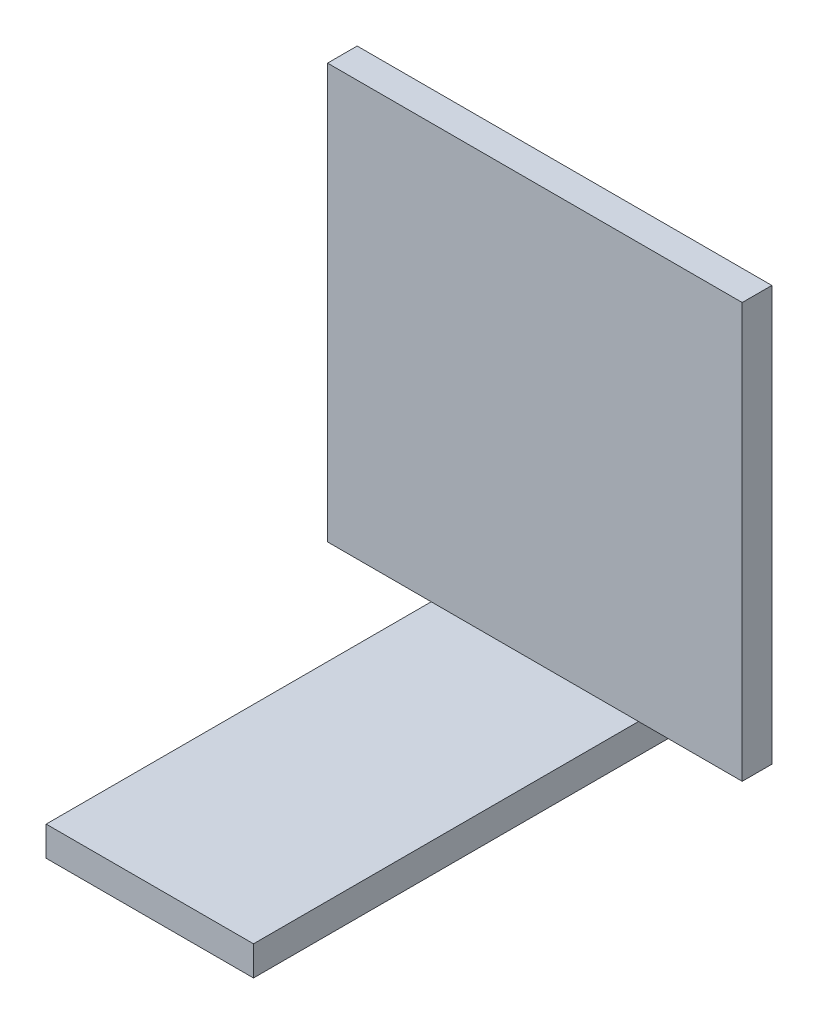
ISO-10303-21;
HEADER;
FILE_DESCRIPTION(('STEP AP214'),'2;1');
FILE_NAME('part.step','',(''),(''),'','','');
FILE_SCHEMA(('AUTOMOTIVE_DESIGN { 1 0 10303 214 1 1 1 1 }'));
ENDSEC;
DATA;
#1=APPLICATION_CONTEXT('core data for automotive mechanical design processes');
#2=APPLICATION_PROTOCOL_DEFINITION('international standard','automotive_design',2000,#1);
#3=PRODUCT_CONTEXT('',#1,'mechanical');
#4=PRODUCT('Part','Part','',(#3));
#5=PRODUCT_RELATED_PRODUCT_CATEGORY('part','',(#4));
#6=PRODUCT_DEFINITION_FORMATION('','',#4);
#7=PRODUCT_DEFINITION_CONTEXT('part definition',#1,'design');
#8=PRODUCT_DEFINITION('design','',#6,#7);
#9=PRODUCT_DEFINITION_SHAPE('','',#8);
#10=(LENGTH_UNIT() NAMED_UNIT(*) SI_UNIT(.MILLI.,.METRE.));
#11=(NAMED_UNIT(*) PLANE_ANGLE_UNIT() SI_UNIT($,.RADIAN.));
#12=(NAMED_UNIT(*) SI_UNIT($,.STERADIAN.) SOLID_ANGLE_UNIT());
#13=UNCERTAINTY_MEASURE_WITH_UNIT(LENGTH_MEASURE(1.E-05),#10,'distance_accuracy_value','');
#14=(GEOMETRIC_REPRESENTATION_CONTEXT(3) GLOBAL_UNCERTAINTY_ASSIGNED_CONTEXT((#13)) GLOBAL_UNIT_ASSIGNED_CONTEXT((#10,
#11,#12)) REPRESENTATION_CONTEXT('',''));
#15=CARTESIAN_POINT('',(0.,0.,0.));
#16=DIRECTION('',(0.,0.,1.));
#17=DIRECTION('',(1.,0.,0.));
#18=AXIS2_PLACEMENT_3D('',#15,#16,#17);
#19=CARTESIAN_POINT('',(0.,5.,0.));
#20=DIRECTION('',(0.,-1.,0.));
#21=DIRECTION('',(0.,0.,-1.));
#22=AXIS2_PLACEMENT_3D('',#19,#20,#21);
#23=PLANE('',#22);
#24=DIRECTION('',(1.,0.,0.));
#25=VECTOR('',#24,1.);
#26=CARTESIAN_POINT('',(52.5,5.,-65.));
#27=LINE('',#26,#25);
#28=CARTESIAN_POINT('',(0.,5.,-65.));
#29=VERTEX_POINT('',#28);
#30=CARTESIAN_POINT('',(35.,5.,-65.));
#31=VERTEX_POINT('',#30);
#32=EDGE_CURVE('E11',#29,#31,#27,.T.);
#33=ORIENTED_EDGE('',*,*,#32,.F.);
#34=DIRECTION('',(0.,0.,1.));
#35=VECTOR('',#34,1.);
#36=CARTESIAN_POINT('',(0.,5.,0.));
#37=LINE('',#36,#35);
#38=CARTESIAN_POINT('',(0.,5.,0.));
#39=VERTEX_POINT('',#38);
#40=EDGE_CURVE('E90',#29,#39,#37,.T.);
#41=ORIENTED_EDGE('',*,*,#40,.T.);
#42=DIRECTION('',(1.,0.,0.));
#43=VECTOR('',#42,1.);
#44=CARTESIAN_POINT('',(0.,5.,0.));
#45=LINE('',#44,#43);
#46=CARTESIAN_POINT('',(35.,5.,0.));
#47=VERTEX_POINT('',#46);
#48=EDGE_CURVE('E161',#39,#47,#45,.T.);
#49=ORIENTED_EDGE('',*,*,#48,.T.);
#50=DIRECTION('',(0.,0.,-1.));
#51=VECTOR('',#50,1.);
#52=CARTESIAN_POINT('',(35.,5.,0.));
#53=LINE('',#52,#51);
#54=EDGE_CURVE('E165',#47,#31,#53,.T.);
#55=ORIENTED_EDGE('',*,*,#54,.T.);
#56=EDGE_LOOP('',(#33,#41,#49,#55));
#57=FACE_BOUND('',#56,.T.);
#58=ADVANCED_FACE('F41',(#57),#23,.F.);
#59=CARTESIAN_POINT('',(0.,5.,0.));
#60=DIRECTION('',(1.,0.,0.));
#61=DIRECTION('',(0.,0.,-1.));
#62=AXIS2_PLACEMENT_3D('',#59,#60,#61);
#63=PLANE('',#62);
#64=DIRECTION('',(0.,0.,1.));
#65=VECTOR('',#64,1.);
#66=CARTESIAN_POINT('',(0.,0.,0.));
#67=LINE('',#66,#65);
#68=CARTESIAN_POINT('',(0.,0.,-70.));
#69=VERTEX_POINT('',#68);
#70=CARTESIAN_POINT('',(0.,0.,0.));
#71=VERTEX_POINT('',#70);
#72=EDGE_CURVE('E146',#69,#71,#67,.T.);
#73=ORIENTED_EDGE('',*,*,#72,.T.);
#74=DIRECTION('',(0.,-1.,0.));
#75=VECTOR('',#74,1.);
#76=CARTESIAN_POINT('',(0.,5.,0.));
#77=LINE('',#76,#75);
#78=EDGE_CURVE('E45',#39,#71,#77,.T.);
#79=ORIENTED_EDGE('',*,*,#78,.F.);
#80=ORIENTED_EDGE('',*,*,#40,.F.);
#81=CARTESIAN_POINT('',(0.,5.,-70.));
#82=VERTEX_POINT('',#81);
#83=EDGE_CURVE('E157',#82,#29,#37,.T.);
#84=ORIENTED_EDGE('',*,*,#83,.F.);
#85=DIRECTION('',(0.,-1.,0.));
#86=VECTOR('',#85,1.);
#87=CARTESIAN_POINT('',(0.,5.,-70.));
#88=LINE('',#87,#86);
#89=EDGE_CURVE('E67',#82,#69,#88,.T.);
#90=ORIENTED_EDGE('',*,*,#89,.T.);
#91=EDGE_LOOP('',(#73,#79,#80,#84,#90));
#92=FACE_BOUND('',#91,.T.);
#93=ADVANCED_FACE('F43',(#92),#63,.F.);
#94=CARTESIAN_POINT('',(0.,5.,0.));
#95=DIRECTION('',(0.,0.,-1.));
#96=DIRECTION('',(-1.,0.,0.));
#97=AXIS2_PLACEMENT_3D('',#94,#95,#96);
#98=PLANE('',#97);
#99=DIRECTION('',(1.,0.,0.));
#100=VECTOR('',#99,1.);
#101=CARTESIAN_POINT('',(0.,0.,0.));
#102=LINE('',#101,#100);
#103=CARTESIAN_POINT('',(35.,0.,0.));
#104=VERTEX_POINT('',#103);
#105=EDGE_CURVE('E151',#71,#104,#102,.T.);
#106=ORIENTED_EDGE('',*,*,#105,.T.);
#107=DIRECTION('',(0.,-1.,0.));
#108=VECTOR('',#107,1.);
#109=CARTESIAN_POINT('',(35.,5.,0.));
#110=LINE('',#109,#108);
#111=EDGE_CURVE('E179',#47,#104,#110,.T.);
#112=ORIENTED_EDGE('',*,*,#111,.F.);
#113=ORIENTED_EDGE('',*,*,#48,.F.);
#114=ORIENTED_EDGE('',*,*,#78,.T.);
#115=EDGE_LOOP('',(#106,#112,#113,#114));
#116=FACE_BOUND('',#115,.T.);
#117=ADVANCED_FACE('F190',(#116),#98,.F.);
#118=CARTESIAN_POINT('',(35.,5.,0.));
#119=DIRECTION('',(-1.,0.,0.));
#120=DIRECTION('',(0.,0.,1.));
#121=AXIS2_PLACEMENT_3D('',#118,#119,#120);
#122=PLANE('',#121);
#123=DIRECTION('',(0.,0.,-1.));
#124=VECTOR('',#123,1.);
#125=CARTESIAN_POINT('',(35.,0.,0.));
#126=LINE('',#125,#124);
#127=CARTESIAN_POINT('',(35.,0.,-70.));
#128=VERTEX_POINT('',#127);
#129=EDGE_CURVE('E170',#104,#128,#126,.T.);
#130=ORIENTED_EDGE('',*,*,#129,.T.);
#131=DIRECTION('',(0.,-1.,0.));
#132=VECTOR('',#131,1.);
#133=CARTESIAN_POINT('',(35.,5.,-70.));
#134=LINE('',#133,#132);
#135=CARTESIAN_POINT('',(35.,5.,-70.));
#136=VERTEX_POINT('',#135);
#137=EDGE_CURVE('E177',#136,#128,#134,.T.);
#138=ORIENTED_EDGE('',*,*,#137,.F.);
#139=EDGE_CURVE('E164',#31,#136,#53,.T.);
#140=ORIENTED_EDGE('',*,*,#139,.F.);
#141=ORIENTED_EDGE('',*,*,#54,.F.);
#142=ORIENTED_EDGE('',*,*,#111,.T.);
#143=EDGE_LOOP('',(#130,#138,#140,#141,#142));
#144=FACE_BOUND('',#143,.T.);
#145=ADVANCED_FACE('F195',(#144),#122,.F.);
#146=CARTESIAN_POINT('',(0.,5.,-70.));
#147=DIRECTION('',(0.,0.,1.));
#148=DIRECTION('',(1.,0.,0.));
#149=AXIS2_PLACEMENT_3D('',#146,#147,#148);
#150=PLANE('',#149);
#151=DIRECTION('',(-1.,0.,0.));
#152=VECTOR('',#151,1.);
#153=CARTESIAN_POINT('',(0.,0.,-70.));
#154=LINE('',#153,#152);
#155=EDGE_CURVE('E87',#128,#69,#154,.T.);
#156=ORIENTED_EDGE('',*,*,#155,.T.);
#157=ORIENTED_EDGE('',*,*,#89,.F.);
#158=DIRECTION('',(-1.,0.,0.));
#159=VECTOR('',#158,1.);
#160=CARTESIAN_POINT('',(52.5,5.,-70.));
#161=LINE('',#160,#159);
#162=CARTESIAN_POINT('',(-17.5,5.,-70.));
#163=VERTEX_POINT('',#162);
#164=EDGE_CURVE('E202',#82,#163,#161,.T.);
#165=ORIENTED_EDGE('',*,*,#164,.T.);
#166=DIRECTION('',(0.,-1.,0.));
#167=VECTOR('',#166,1.);
#168=CARTESIAN_POINT('',(-17.5,75.,-70.));
#169=LINE('',#168,#167);
#170=CARTESIAN_POINT('',(-17.5,75.,-70.));
#171=VERTEX_POINT('',#170);
#172=EDGE_CURVE('E126',#171,#163,#169,.T.);
#173=ORIENTED_EDGE('',*,*,#172,.F.);
#174=DIRECTION('',(-1.,0.,0.));
#175=VECTOR('',#174,1.);
#176=CARTESIAN_POINT('',(52.5,75.,-70.));
#177=LINE('',#176,#175);
#178=CARTESIAN_POINT('',(52.5,75.,-70.));
#179=VERTEX_POINT('',#178);
#180=EDGE_CURVE('E118',#179,#171,#177,.T.);
#181=ORIENTED_EDGE('',*,*,#180,.F.);
#182=DIRECTION('',(0.,-1.,0.));
#183=VECTOR('',#182,1.);
#184=CARTESIAN_POINT('',(52.5,75.,-70.));
#185=LINE('',#184,#183);
#186=CARTESIAN_POINT('',(52.5,5.,-70.));
#187=VERTEX_POINT('',#186);
#188=EDGE_CURVE('E123',#179,#187,#185,.T.);
#189=ORIENTED_EDGE('',*,*,#188,.T.);
#190=EDGE_CURVE('E198',#187,#136,#161,.T.);
#191=ORIENTED_EDGE('',*,*,#190,.T.);
#192=ORIENTED_EDGE('',*,*,#137,.T.);
#193=EDGE_LOOP('',(#156,#157,#165,#173,#181,#189,#191,#192));
#194=FACE_BOUND('',#193,.T.);
#195=ADVANCED_FACE('F120',(#194),#150,.F.);
#196=CARTESIAN_POINT('',(0.,0.,0.));
#197=DIRECTION('',(0.,-1.,0.));
#198=DIRECTION('',(0.,0.,-1.));
#199=AXIS2_PLACEMENT_3D('',#196,#197,#198);
#200=PLANE('',#199);
#201=ORIENTED_EDGE('',*,*,#72,.F.);
#202=ORIENTED_EDGE('',*,*,#155,.F.);
#203=ORIENTED_EDGE('',*,*,#129,.F.);
#204=ORIENTED_EDGE('',*,*,#105,.F.);
#205=EDGE_LOOP('',(#201,#202,#203,#204));
#206=FACE_BOUND('',#205,.T.);
#207=ADVANCED_FACE('F194',(#206),#200,.T.);
#208=CARTESIAN_POINT('',(0.,5.,0.));
#209=DIRECTION('',(0.,-1.,0.));
#210=DIRECTION('',(0.,0.,-1.));
#211=AXIS2_PLACEMENT_3D('',#208,#209,#210);
#212=PLANE('',#211);
#213=ORIENTED_EDGE('',*,*,#164,.F.);
#214=ORIENTED_EDGE('',*,*,#83,.T.);
#215=CARTESIAN_POINT('',(-17.5,5.,-65.));
#216=VERTEX_POINT('',#215);
#217=EDGE_CURVE('E52',#216,#29,#27,.T.);
#218=ORIENTED_EDGE('',*,*,#217,.F.);
#219=DIRECTION('',(0.,0.,1.));
#220=VECTOR('',#219,1.);
#221=CARTESIAN_POINT('',(-17.5,5.,-70.));
#222=LINE('',#221,#220);
#223=EDGE_CURVE('E201',#163,#216,#222,.T.);
#224=ORIENTED_EDGE('',*,*,#223,.F.);
#225=EDGE_LOOP('',(#213,#214,#218,#224));
#226=FACE_BOUND('',#225,.T.);
#227=ADVANCED_FACE('F224',(#226),#212,.T.);
#228=CARTESIAN_POINT('',(52.5,75.,-70.));
#229=DIRECTION('',(-1.,0.,0.));
#230=DIRECTION('',(0.,0.,1.));
#231=AXIS2_PLACEMENT_3D('',#228,#229,#230);
#232=PLANE('',#231);
#233=DIRECTION('',(0.,0.,-1.));
#234=VECTOR('',#233,1.);
#235=CARTESIAN_POINT('',(52.5,5.,-70.));
#236=LINE('',#235,#234);
#237=CARTESIAN_POINT('',(52.5,5.,-65.));
#238=VERTEX_POINT('',#237);
#239=EDGE_CURVE('E144',#238,#187,#236,.T.);
#240=ORIENTED_EDGE('',*,*,#239,.T.);
#241=ORIENTED_EDGE('',*,*,#188,.F.);
#242=DIRECTION('',(0.,0.,-1.));
#243=VECTOR('',#242,1.);
#244=CARTESIAN_POINT('',(52.5,75.,-70.));
#245=LINE('',#244,#243);
#246=CARTESIAN_POINT('',(52.5,75.,-65.));
#247=VERTEX_POINT('',#246);
#248=EDGE_CURVE('E131',#247,#179,#245,.T.);
#249=ORIENTED_EDGE('',*,*,#248,.F.);
#250=DIRECTION('',(0.,-1.,0.));
#251=VECTOR('',#250,1.);
#252=CARTESIAN_POINT('',(52.5,75.,-65.));
#253=LINE('',#252,#251);
#254=EDGE_CURVE('E212',#247,#238,#253,.T.);
#255=ORIENTED_EDGE('',*,*,#254,.T.);
#256=EDGE_LOOP('',(#240,#241,#249,#255));
#257=FACE_BOUND('',#256,.T.);
#258=ADVANCED_FACE('F142',(#257),#232,.F.);
#259=CARTESIAN_POINT('',(-17.5,75.,-70.));
#260=DIRECTION('',(1.,0.,0.));
#261=DIRECTION('',(0.,0.,-1.));
#262=AXIS2_PLACEMENT_3D('',#259,#260,#261);
#263=PLANE('',#262);
#264=ORIENTED_EDGE('',*,*,#223,.T.);
#265=DIRECTION('',(0.,-1.,0.));
#266=VECTOR('',#265,1.);
#267=CARTESIAN_POINT('',(-17.5,75.,-65.));
#268=LINE('',#267,#266);
#269=CARTESIAN_POINT('',(-17.5,75.,-65.));
#270=VERTEX_POINT('',#269);
#271=EDGE_CURVE('E153',#270,#216,#268,.T.);
#272=ORIENTED_EDGE('',*,*,#271,.F.);
#273=DIRECTION('',(0.,0.,1.));
#274=VECTOR('',#273,1.);
#275=CARTESIAN_POINT('',(-17.5,75.,-70.));
#276=LINE('',#275,#274);
#277=EDGE_CURVE('E130',#171,#270,#276,.T.);
#278=ORIENTED_EDGE('',*,*,#277,.F.);
#279=ORIENTED_EDGE('',*,*,#172,.T.);
#280=EDGE_LOOP('',(#264,#272,#278,#279));
#281=FACE_BOUND('',#280,.T.);
#282=ADVANCED_FACE('F271',(#281),#263,.F.);
#283=CARTESIAN_POINT('',(52.5,75.,-65.));
#284=DIRECTION('',(0.,0.,-1.));
#285=DIRECTION('',(-1.,0.,0.));
#286=AXIS2_PLACEMENT_3D('',#283,#284,#285);
#287=PLANE('',#286);
#288=ORIENTED_EDGE('',*,*,#217,.T.);
#289=ORIENTED_EDGE('',*,*,#32,.T.);
#290=EDGE_CURVE('E53',#31,#238,#27,.T.);
#291=ORIENTED_EDGE('',*,*,#290,.T.);
#292=ORIENTED_EDGE('',*,*,#254,.F.);
#293=DIRECTION('',(1.,0.,0.));
#294=VECTOR('',#293,1.);
#295=CARTESIAN_POINT('',(52.5,75.,-65.));
#296=LINE('',#295,#294);
#297=EDGE_CURVE('E136',#270,#247,#296,.T.);
#298=ORIENTED_EDGE('',*,*,#297,.F.);
#299=ORIENTED_EDGE('',*,*,#271,.T.);
#300=EDGE_LOOP('',(#288,#289,#291,#292,#298,#299));
#301=FACE_BOUND('',#300,.T.);
#302=ADVANCED_FACE('F219',(#301),#287,.F.);
#303=CARTESIAN_POINT('',(0.,75.,0.));
#304=DIRECTION('',(0.,-1.,0.));
#305=DIRECTION('',(0.,0.,-1.));
#306=AXIS2_PLACEMENT_3D('',#303,#304,#305);
#307=PLANE('',#306);
#308=ORIENTED_EDGE('',*,*,#248,.T.);
#309=ORIENTED_EDGE('',*,*,#180,.T.);
#310=ORIENTED_EDGE('',*,*,#277,.T.);
#311=ORIENTED_EDGE('',*,*,#297,.T.);
#312=EDGE_LOOP('',(#308,#309,#310,#311));
#313=FACE_BOUND('',#312,.T.);
#314=ADVANCED_FACE('F134',(#313),#307,.F.);
#315=ORIENTED_EDGE('',*,*,#290,.F.);
#316=ORIENTED_EDGE('',*,*,#139,.T.);
#317=ORIENTED_EDGE('',*,*,#190,.F.);
#318=ORIENTED_EDGE('',*,*,#239,.F.);
#319=EDGE_LOOP('',(#315,#316,#317,#318));
#320=FACE_BOUND('',#319,.T.);
#321=ADVANCED_FACE('F228',(#320),#212,.T.);
#322=CLOSED_SHELL('',(#58,#93,#117,#145,#195,#207,#227,#258,#282,#302,#314,#321));
#323=MANIFOLD_SOLID_BREP('B2',#322);
#324=ADVANCED_BREP_SHAPE_REPRESENTATION('',(#18,#323),#14);
#325=SHAPE_DEFINITION_REPRESENTATION(#9,#324);
ENDSEC;
END-ISO-10303-21;
